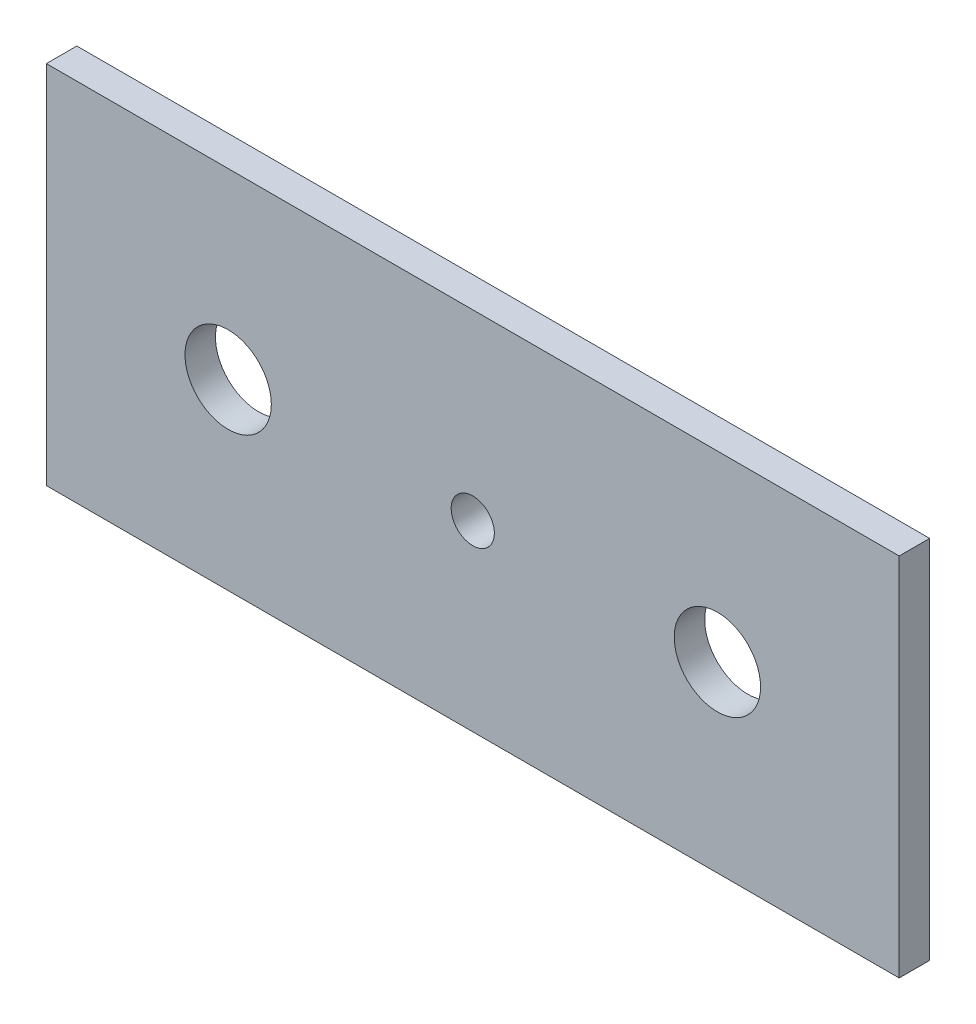
ISO-10303-21;
HEADER;
FILE_DESCRIPTION(('STEP AP214'),'2;1');
FILE_NAME('part.step','',(''),(''),'','','');
FILE_SCHEMA(('AUTOMOTIVE_DESIGN { 1 0 10303 214 1 1 1 1 }'));
ENDSEC;
DATA;
#1=APPLICATION_CONTEXT('core data for automotive mechanical design processes');
#2=APPLICATION_PROTOCOL_DEFINITION('international standard','automotive_design',2000,#1);
#3=PRODUCT_CONTEXT('',#1,'mechanical');
#4=PRODUCT('Part','Part','',(#3));
#5=PRODUCT_RELATED_PRODUCT_CATEGORY('part','',(#4));
#6=PRODUCT_DEFINITION_FORMATION('','',#4);
#7=PRODUCT_DEFINITION_CONTEXT('part definition',#1,'design');
#8=PRODUCT_DEFINITION('design','',#6,#7);
#9=PRODUCT_DEFINITION_SHAPE('','',#8);
#10=(LENGTH_UNIT() NAMED_UNIT(*) SI_UNIT(.MILLI.,.METRE.));
#11=(NAMED_UNIT(*) PLANE_ANGLE_UNIT() SI_UNIT($,.RADIAN.));
#12=(NAMED_UNIT(*) SI_UNIT($,.STERADIAN.) SOLID_ANGLE_UNIT());
#13=UNCERTAINTY_MEASURE_WITH_UNIT(LENGTH_MEASURE(1.E-05),#10,'distance_accuracy_value','');
#14=(GEOMETRIC_REPRESENTATION_CONTEXT(3) GLOBAL_UNCERTAINTY_ASSIGNED_CONTEXT((#13)) GLOBAL_UNIT_ASSIGNED_CONTEXT((#10,
#11,#12)) REPRESENTATION_CONTEXT('',''));
#15=CARTESIAN_POINT('',(0.,0.,0.));
#16=DIRECTION('',(0.,0.,1.));
#17=DIRECTION('',(1.,0.,0.));
#18=AXIS2_PLACEMENT_3D('',#15,#16,#17);
#19=CARTESIAN_POINT('',(-44.45,-19.05,-3.175));
#20=DIRECTION('',(-1.,0.,0.));
#21=DIRECTION('',(0.,0.,1.));
#22=AXIS2_PLACEMENT_3D('',#19,#20,#21);
#23=PLANE('',#22);
#24=DIRECTION('',(0.,-1.,0.));
#25=VECTOR('',#24,1.);
#26=CARTESIAN_POINT('',(-44.45,-19.05,0.));
#27=LINE('',#26,#25);
#28=CARTESIAN_POINT('',(-44.45,19.05,0.));
#29=VERTEX_POINT('',#28);
#30=CARTESIAN_POINT('',(-44.45,-19.05,0.));
#31=VERTEX_POINT('',#30);
#32=EDGE_CURVE('E104',#29,#31,#27,.T.);
#33=ORIENTED_EDGE('',*,*,#32,.F.);
#34=DIRECTION('',(0.,0.,1.));
#35=VECTOR('',#34,1.);
#36=CARTESIAN_POINT('',(-44.45,19.05,-3.175));
#37=LINE('',#36,#35);
#38=CARTESIAN_POINT('',(-44.45,19.05,-3.175));
#39=VERTEX_POINT('',#38);
#40=EDGE_CURVE('E11',#39,#29,#37,.T.);
#41=ORIENTED_EDGE('',*,*,#40,.F.);
#42=DIRECTION('',(0.,-1.,0.));
#43=VECTOR('',#42,1.);
#44=CARTESIAN_POINT('',(-44.45,-19.05,-3.175));
#45=LINE('',#44,#43);
#46=CARTESIAN_POINT('',(-44.45,-19.05,-3.175));
#47=VERTEX_POINT('',#46);
#48=EDGE_CURVE('E97',#39,#47,#45,.T.);
#49=ORIENTED_EDGE('',*,*,#48,.T.);
#50=DIRECTION('',(0.,0.,1.));
#51=VECTOR('',#50,1.);
#52=CARTESIAN_POINT('',(-44.45,-19.05,-3.175));
#53=LINE('',#52,#51);
#54=EDGE_CURVE('E42',#47,#31,#53,.T.);
#55=ORIENTED_EDGE('',*,*,#54,.T.);
#56=EDGE_LOOP('',(#33,#41,#49,#55));
#57=FACE_BOUND('',#56,.T.);
#58=ADVANCED_FACE('F39',(#57),#23,.T.);
#59=CARTESIAN_POINT('',(44.45,19.05,-3.175));
#60=DIRECTION('',(0.,1.,0.));
#61=DIRECTION('',(0.,0.,1.));
#62=AXIS2_PLACEMENT_3D('',#59,#60,#61);
#63=PLANE('',#62);
#64=DIRECTION('',(-1.,0.,0.));
#65=VECTOR('',#64,1.);
#66=CARTESIAN_POINT('',(44.45,19.05,0.));
#67=LINE('',#66,#65);
#68=CARTESIAN_POINT('',(44.45,19.05,0.));
#69=VERTEX_POINT('',#68);
#70=EDGE_CURVE('E99',#69,#29,#67,.T.);
#71=ORIENTED_EDGE('',*,*,#70,.F.);
#72=DIRECTION('',(0.,0.,1.));
#73=VECTOR('',#72,1.);
#74=CARTESIAN_POINT('',(44.45,19.05,-3.175));
#75=LINE('',#74,#73);
#76=CARTESIAN_POINT('',(44.45,19.05,-3.175));
#77=VERTEX_POINT('',#76);
#78=EDGE_CURVE('E48',#77,#69,#75,.T.);
#79=ORIENTED_EDGE('',*,*,#78,.F.);
#80=DIRECTION('',(-1.,0.,0.));
#81=VECTOR('',#80,1.);
#82=CARTESIAN_POINT('',(44.45,19.05,-3.175));
#83=LINE('',#82,#81);
#84=EDGE_CURVE('E94',#77,#39,#83,.T.);
#85=ORIENTED_EDGE('',*,*,#84,.T.);
#86=ORIENTED_EDGE('',*,*,#40,.T.);
#87=EDGE_LOOP('',(#71,#79,#85,#86));
#88=FACE_BOUND('',#87,.T.);
#89=ADVANCED_FACE('F115',(#88),#63,.T.);
#90=CARTESIAN_POINT('',(44.45,-19.05,-3.175));
#91=DIRECTION('',(1.,0.,0.));
#92=DIRECTION('',(0.,0.,-1.));
#93=AXIS2_PLACEMENT_3D('',#90,#91,#92);
#94=PLANE('',#93);
#95=DIRECTION('',(0.,1.,0.));
#96=VECTOR('',#95,1.);
#97=CARTESIAN_POINT('',(44.45,-19.05,0.));
#98=LINE('',#97,#96);
#99=CARTESIAN_POINT('',(44.45,-19.05,0.));
#100=VERTEX_POINT('',#99);
#101=EDGE_CURVE('E89',#100,#69,#98,.T.);
#102=ORIENTED_EDGE('',*,*,#101,.F.);
#103=DIRECTION('',(0.,0.,1.));
#104=VECTOR('',#103,1.);
#105=CARTESIAN_POINT('',(44.45,-19.05,-3.175));
#106=LINE('',#105,#104);
#107=CARTESIAN_POINT('',(44.45,-19.05,-3.175));
#108=VERTEX_POINT('',#107);
#109=EDGE_CURVE('E84',#108,#100,#106,.T.);
#110=ORIENTED_EDGE('',*,*,#109,.F.);
#111=DIRECTION('',(0.,1.,0.));
#112=VECTOR('',#111,1.);
#113=CARTESIAN_POINT('',(44.45,-19.05,-3.175));
#114=LINE('',#113,#112);
#115=EDGE_CURVE('E87',#108,#77,#114,.T.);
#116=ORIENTED_EDGE('',*,*,#115,.T.);
#117=ORIENTED_EDGE('',*,*,#78,.T.);
#118=EDGE_LOOP('',(#102,#110,#116,#117));
#119=FACE_BOUND('',#118,.T.);
#120=ADVANCED_FACE('F86',(#119),#94,.T.);
#121=CARTESIAN_POINT('',(44.45,-19.05,-3.175));
#122=DIRECTION('',(0.,-1.,0.));
#123=DIRECTION('',(0.,0.,-1.));
#124=AXIS2_PLACEMENT_3D('',#121,#122,#123);
#125=PLANE('',#124);
#126=DIRECTION('',(1.,0.,0.));
#127=VECTOR('',#126,1.);
#128=CARTESIAN_POINT('',(44.45,-19.05,0.));
#129=LINE('',#128,#127);
#130=EDGE_CURVE('E107',#31,#100,#129,.T.);
#131=ORIENTED_EDGE('',*,*,#130,.F.);
#132=ORIENTED_EDGE('',*,*,#54,.F.);
#133=DIRECTION('',(1.,0.,0.));
#134=VECTOR('',#133,1.);
#135=CARTESIAN_POINT('',(44.45,-19.05,-3.175));
#136=LINE('',#135,#134);
#137=EDGE_CURVE('E93',#47,#108,#136,.T.);
#138=ORIENTED_EDGE('',*,*,#137,.T.);
#139=ORIENTED_EDGE('',*,*,#109,.T.);
#140=EDGE_LOOP('',(#131,#132,#138,#139));
#141=FACE_BOUND('',#140,.T.);
#142=ADVANCED_FACE('F96',(#141),#125,.T.);
#143=CARTESIAN_POINT('',(0.,0.,-3.175));
#144=DIRECTION('',(0.,0.,1.));
#145=DIRECTION('',(1.,0.,0.));
#146=AXIS2_PLACEMENT_3D('',#143,#144,#145);
#147=PLANE('',#146);
#148=CARTESIAN_POINT('',(-25.5,0.,-3.175));
#149=DIRECTION('',(0.,0.,1.));
#150=DIRECTION('',(1.,0.,0.));
#151=AXIS2_PLACEMENT_3D('',#148,#149,#150);
#152=CIRCLE('',#151,4.5);
#153=CARTESIAN_POINT('',(-21.,0.,-3.175));
#154=VERTEX_POINT('',#153);
#155=EDGE_CURVE('E152',#154,#154,#152,.T.);
#156=ORIENTED_EDGE('',*,*,#155,.T.);
#157=EDGE_LOOP('',(#156));
#158=FACE_BOUND('',#157,.T.);
#159=CARTESIAN_POINT('',(25.5,0.,-3.175));
#160=DIRECTION('',(0.,0.,1.));
#161=DIRECTION('',(1.,0.,0.));
#162=AXIS2_PLACEMENT_3D('',#159,#160,#161);
#163=CIRCLE('',#162,4.5);
#164=CARTESIAN_POINT('',(30.,0.,-3.175));
#165=VERTEX_POINT('',#164);
#166=EDGE_CURVE('E162',#165,#165,#163,.T.);
#167=ORIENTED_EDGE('',*,*,#166,.T.);
#168=EDGE_LOOP('',(#167));
#169=FACE_BOUND('',#168,.T.);
#170=CARTESIAN_POINT('',(0.,0.,-3.175));
#171=DIRECTION('',(0.,0.,1.));
#172=DIRECTION('',(1.,0.,0.));
#173=AXIS2_PLACEMENT_3D('',#170,#171,#172);
#174=CIRCLE('',#173,2.25);
#175=CARTESIAN_POINT('',(2.25,0.,-3.175));
#176=VERTEX_POINT('',#175);
#177=EDGE_CURVE('E108',#176,#176,#174,.T.);
#178=ORIENTED_EDGE('',*,*,#177,.T.);
#179=EDGE_LOOP('',(#178));
#180=FACE_BOUND('',#179,.T.);
#181=ORIENTED_EDGE('',*,*,#48,.F.);
#182=ORIENTED_EDGE('',*,*,#84,.F.);
#183=ORIENTED_EDGE('',*,*,#115,.F.);
#184=ORIENTED_EDGE('',*,*,#137,.F.);
#185=EDGE_LOOP('',(#181,#182,#183,#184));
#186=FACE_BOUND('',#185,.T.);
#187=ADVANCED_FACE('F92',(#158,#169,#180,#186),#147,.F.);
#188=CARTESIAN_POINT('',(0.,0.,0.));
#189=DIRECTION('',(0.,0.,1.));
#190=DIRECTION('',(1.,0.,0.));
#191=AXIS2_PLACEMENT_3D('',#188,#189,#190);
#192=PLANE('',#191);
#193=CARTESIAN_POINT('',(-25.5,0.,0.));
#194=DIRECTION('',(0.,0.,1.));
#195=DIRECTION('',(1.,0.,0.));
#196=AXIS2_PLACEMENT_3D('',#193,#194,#195);
#197=CIRCLE('',#196,4.5);
#198=CARTESIAN_POINT('',(-21.,0.,0.));
#199=VERTEX_POINT('',#198);
#200=EDGE_CURVE('E155',#199,#199,#197,.T.);
#201=ORIENTED_EDGE('',*,*,#200,.F.);
#202=EDGE_LOOP('',(#201));
#203=FACE_BOUND('',#202,.T.);
#204=CARTESIAN_POINT('',(25.5,0.,0.));
#205=DIRECTION('',(0.,0.,1.));
#206=DIRECTION('',(1.,0.,0.));
#207=AXIS2_PLACEMENT_3D('',#204,#205,#206);
#208=CIRCLE('',#207,4.5);
#209=CARTESIAN_POINT('',(30.,0.,0.));
#210=VERTEX_POINT('',#209);
#211=EDGE_CURVE('E157',#210,#210,#208,.T.);
#212=ORIENTED_EDGE('',*,*,#211,.F.);
#213=EDGE_LOOP('',(#212));
#214=FACE_BOUND('',#213,.T.);
#215=CARTESIAN_POINT('',(0.,0.,0.));
#216=DIRECTION('',(0.,0.,1.));
#217=DIRECTION('',(1.,0.,0.));
#218=AXIS2_PLACEMENT_3D('',#215,#216,#217);
#219=CIRCLE('',#218,2.25);
#220=CARTESIAN_POINT('',(2.25,0.,0.));
#221=VERTEX_POINT('',#220);
#222=EDGE_CURVE('E165',#221,#221,#219,.T.);
#223=ORIENTED_EDGE('',*,*,#222,.F.);
#224=EDGE_LOOP('',(#223));
#225=FACE_BOUND('',#224,.T.);
#226=ORIENTED_EDGE('',*,*,#32,.T.);
#227=ORIENTED_EDGE('',*,*,#130,.T.);
#228=ORIENTED_EDGE('',*,*,#101,.T.);
#229=ORIENTED_EDGE('',*,*,#70,.T.);
#230=EDGE_LOOP('',(#226,#227,#228,#229));
#231=FACE_BOUND('',#230,.T.);
#232=ADVANCED_FACE('F114',(#203,#214,#225,#231),#192,.T.);
#233=CARTESIAN_POINT('',(0.,0.,0.));
#234=DIRECTION('',(0.,0.,1.));
#235=DIRECTION('',(1.,0.,0.));
#236=AXIS2_PLACEMENT_3D('',#233,#234,#235);
#237=CYLINDRICAL_SURFACE('',#236,2.25);
#238=ORIENTED_EDGE('',*,*,#177,.F.);
#239=EDGE_LOOP('',(#238));
#240=FACE_BOUND('',#239,.T.);
#241=ORIENTED_EDGE('',*,*,#222,.T.);
#242=EDGE_LOOP('',(#241));
#243=FACE_BOUND('',#242,.T.);
#244=ADVANCED_FACE('F134',(#240,#243),#237,.F.);
#245=CARTESIAN_POINT('',(25.5,0.,0.));
#246=DIRECTION('',(0.,0.,1.));
#247=DIRECTION('',(1.,0.,0.));
#248=AXIS2_PLACEMENT_3D('',#245,#246,#247);
#249=CYLINDRICAL_SURFACE('',#248,4.5);
#250=ORIENTED_EDGE('',*,*,#166,.F.);
#251=EDGE_LOOP('',(#250));
#252=FACE_BOUND('',#251,.T.);
#253=ORIENTED_EDGE('',*,*,#211,.T.);
#254=EDGE_LOOP('',(#253));
#255=FACE_BOUND('',#254,.T.);
#256=ADVANCED_FACE('F140',(#252,#255),#249,.F.);
#257=CARTESIAN_POINT('',(-25.5,0.,0.));
#258=DIRECTION('',(0.,0.,1.));
#259=DIRECTION('',(1.,0.,0.));
#260=AXIS2_PLACEMENT_3D('',#257,#258,#259);
#261=CYLINDRICAL_SURFACE('',#260,4.5);
#262=ORIENTED_EDGE('',*,*,#155,.F.);
#263=EDGE_LOOP('',(#262));
#264=FACE_BOUND('',#263,.T.);
#265=ORIENTED_EDGE('',*,*,#200,.T.);
#266=EDGE_LOOP('',(#265));
#267=FACE_BOUND('',#266,.T.);
#268=ADVANCED_FACE('F144',(#264,#267),#261,.F.);
#269=CLOSED_SHELL('',(#58,#89,#120,#142,#187,#232,#244,#256,#268));
#270=MANIFOLD_SOLID_BREP('B2',#269);
#271=ADVANCED_BREP_SHAPE_REPRESENTATION('',(#18,#270),#14);
#272=SHAPE_DEFINITION_REPRESENTATION(#9,#271);
ENDSEC;
END-ISO-10303-21;
